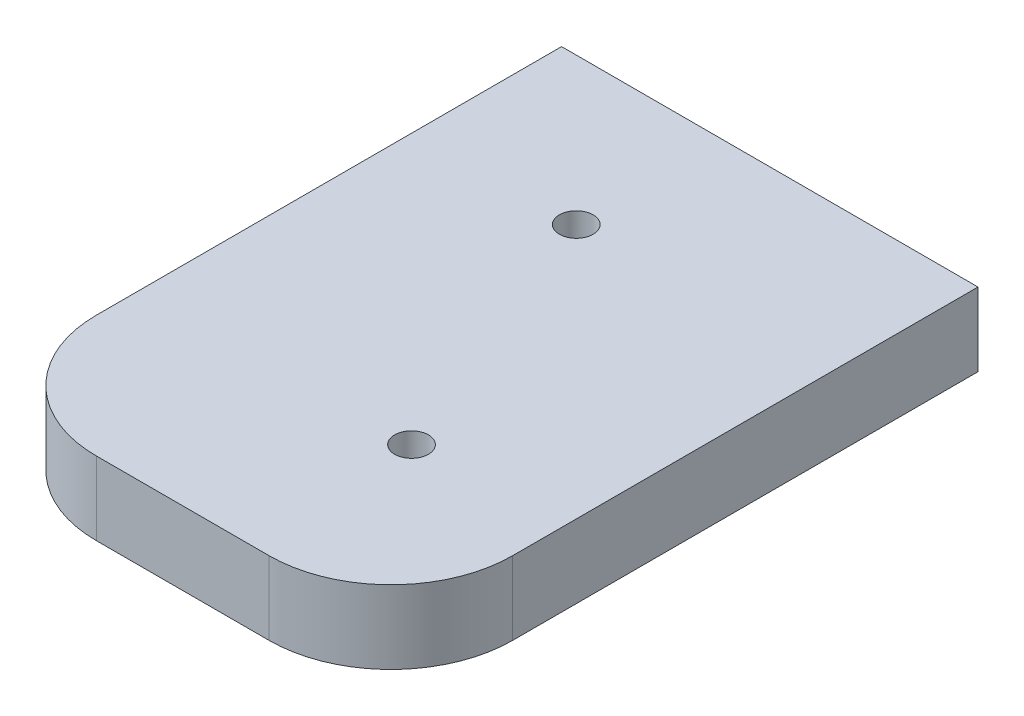
ISO-10303-21;
HEADER;
FILE_DESCRIPTION(('STEP AP214'),'2;1');
FILE_NAME('part.step','',(''),(''),'','','');
FILE_SCHEMA(('AUTOMOTIVE_DESIGN { 1 0 10303 214 1 1 1 1 }'));
ENDSEC;
DATA;
#1=APPLICATION_CONTEXT('core data for automotive mechanical design processes');
#2=APPLICATION_PROTOCOL_DEFINITION('international standard','automotive_design',2000,#1);
#3=PRODUCT_CONTEXT('',#1,'mechanical');
#4=PRODUCT('Part','Part','',(#3));
#5=PRODUCT_RELATED_PRODUCT_CATEGORY('part','',(#4));
#6=PRODUCT_DEFINITION_FORMATION('','',#4);
#7=PRODUCT_DEFINITION_CONTEXT('part definition',#1,'design');
#8=PRODUCT_DEFINITION('design','',#6,#7);
#9=PRODUCT_DEFINITION_SHAPE('','',#8);
#10=(LENGTH_UNIT() NAMED_UNIT(*) SI_UNIT(.MILLI.,.METRE.));
#11=(NAMED_UNIT(*) PLANE_ANGLE_UNIT() SI_UNIT($,.RADIAN.));
#12=(NAMED_UNIT(*) SI_UNIT($,.STERADIAN.) SOLID_ANGLE_UNIT());
#13=UNCERTAINTY_MEASURE_WITH_UNIT(LENGTH_MEASURE(1.E-05),#10,'distance_accuracy_value','');
#14=(GEOMETRIC_REPRESENTATION_CONTEXT(3) GLOBAL_UNCERTAINTY_ASSIGNED_CONTEXT((#13)) GLOBAL_UNIT_ASSIGNED_CONTEXT((#10,
#11,#12)) REPRESENTATION_CONTEXT('',''));
#15=CARTESIAN_POINT('',(0.,0.,0.));
#16=DIRECTION('',(0.,0.,1.));
#17=DIRECTION('',(1.,0.,0.));
#18=AXIS2_PLACEMENT_3D('',#15,#16,#17);
#19=CARTESIAN_POINT('',(0.,16.,0.));
#20=DIRECTION('',(0.,-1.,0.));
#21=DIRECTION('',(0.,0.,-1.));
#22=AXIS2_PLACEMENT_3D('',#19,#20,#21);
#23=PLANE('',#22);
#24=DIRECTION('',(-1.,0.,0.));
#25=VECTOR('',#24,1.);
#26=CARTESIAN_POINT('',(14.185,16.,-20.));
#27=LINE('',#26,#25);
#28=CARTESIAN_POINT('',(14.185,16.,-20.));
#29=VERTEX_POINT('',#28);
#30=CARTESIAN_POINT('',(-14.185,16.,-20.));
#31=VERTEX_POINT('',#30);
#32=EDGE_CURVE('E54',#29,#31,#27,.T.);
#33=ORIENTED_EDGE('',*,*,#32,.F.);
#34=DIRECTION('',(0.,0.,-1.));
#35=VECTOR('',#34,1.);
#36=CARTESIAN_POINT('',(14.185,16.,20.));
#37=LINE('',#36,#35);
#38=CARTESIAN_POINT('',(14.185,16.,11.7));
#39=VERTEX_POINT('',#38);
#40=EDGE_CURVE('E102',#39,#29,#37,.T.);
#41=ORIENTED_EDGE('',*,*,#40,.F.);
#42=CARTESIAN_POINT('',(5.885,16.,11.7));
#43=DIRECTION('',(0.,1.,0.));
#44=DIRECTION('',(0.,0.,1.));
#45=AXIS2_PLACEMENT_3D('',#42,#43,#44);
#46=CIRCLE('',#45,8.3);
#47=CARTESIAN_POINT('',(5.885,16.,20.));
#48=VERTEX_POINT('',#47);
#49=EDGE_CURVE('E80',#39,#48,#46,.F.);
#50=ORIENTED_EDGE('',*,*,#49,.T.);
#51=DIRECTION('',(1.,0.,0.));
#52=VECTOR('',#51,1.);
#53=CARTESIAN_POINT('',(-14.185,16.,20.));
#54=LINE('',#53,#52);
#55=CARTESIAN_POINT('',(-5.885,16.,20.));
#56=VERTEX_POINT('',#55);
#57=EDGE_CURVE('E129',#56,#48,#54,.T.);
#58=ORIENTED_EDGE('',*,*,#57,.F.);
#59=CARTESIAN_POINT('',(-5.885,16.,11.7));
#60=DIRECTION('',(0.,1.,0.));
#61=DIRECTION('',(0.,0.,1.));
#62=AXIS2_PLACEMENT_3D('',#59,#60,#61);
#63=CIRCLE('',#62,8.3);
#64=CARTESIAN_POINT('',(-14.185,16.,11.7));
#65=VERTEX_POINT('',#64);
#66=EDGE_CURVE('E72',#56,#65,#63,.F.);
#67=ORIENTED_EDGE('',*,*,#66,.T.);
#68=DIRECTION('',(0.,0.,1.));
#69=VECTOR('',#68,1.);
#70=CARTESIAN_POINT('',(-14.185,16.,-20.));
#71=LINE('',#70,#69);
#72=EDGE_CURVE('E104',#31,#65,#71,.T.);
#73=ORIENTED_EDGE('',*,*,#72,.F.);
#74=EDGE_LOOP('',(#33,#41,#50,#58,#67,#73));
#75=FACE_BOUND('',#74,.T.);
#76=CARTESIAN_POINT('',(-3.185,16.,-10.));
#77=DIRECTION('',(0.,-1.,0.));
#78=DIRECTION('',(0.,0.,-1.));
#79=AXIS2_PLACEMENT_3D('',#76,#77,#78);
#80=CIRCLE('',#79,1.15);
#81=CARTESIAN_POINT('',(-3.185,16.,-11.15));
#82=VERTEX_POINT('',#81);
#83=EDGE_CURVE('E46',#82,#82,#80,.T.);
#84=ORIENTED_EDGE('',*,*,#83,.F.);
#85=EDGE_LOOP('',(#84));
#86=FACE_BOUND('',#85,.T.);
#87=CARTESIAN_POINT('',(4.185,16.,8.59255496159686));
#88=DIRECTION('',(0.,1.,0.));
#89=DIRECTION('',(0.,0.,1.));
#90=AXIS2_PLACEMENT_3D('',#87,#88,#89);
#91=CIRCLE('',#90,1.15);
#92=CARTESIAN_POINT('',(4.185,16.,7.44255496159686));
#93=VERTEX_POINT('',#92);
#94=EDGE_CURVE('E113',#93,#93,#91,.T.);
#95=ORIENTED_EDGE('',*,*,#94,.T.);
#96=EDGE_LOOP('',(#95));
#97=FACE_BOUND('',#96,.T.);
#98=ADVANCED_FACE('F36',(#75,#86,#97),#23,.T.);
#99=CARTESIAN_POINT('',(-14.185,5.,-20.));
#100=DIRECTION('',(0.,0.,1.));
#101=DIRECTION('',(1.,0.,0.));
#102=AXIS2_PLACEMENT_3D('',#99,#100,#101);
#103=PLANE('',#102);
#104=DIRECTION('',(0.,-1.,0.));
#105=VECTOR('',#104,1.);
#106=CARTESIAN_POINT('',(14.185,5.,-20.));
#107=LINE('',#106,#105);
#108=CARTESIAN_POINT('',(14.185,21.,-20.));
#109=VERTEX_POINT('',#108);
#110=EDGE_CURVE('E40',#109,#29,#107,.T.);
#111=ORIENTED_EDGE('',*,*,#110,.T.);
#112=ORIENTED_EDGE('',*,*,#32,.T.);
#113=DIRECTION('',(0.,-1.,0.));
#114=VECTOR('',#113,1.);
#115=CARTESIAN_POINT('',(-14.185,21.,-20.));
#116=LINE('',#115,#114);
#117=CARTESIAN_POINT('',(-14.185,21.,-20.));
#118=VERTEX_POINT('',#117);
#119=EDGE_CURVE('E116',#118,#31,#116,.T.);
#120=ORIENTED_EDGE('',*,*,#119,.F.);
#121=DIRECTION('',(-1.,0.,0.));
#122=VECTOR('',#121,1.);
#123=CARTESIAN_POINT('',(14.185,21.,-20.));
#124=LINE('',#123,#122);
#125=EDGE_CURVE('E65',#109,#118,#124,.T.);
#126=ORIENTED_EDGE('',*,*,#125,.F.);
#127=EDGE_LOOP('',(#111,#112,#120,#126));
#128=FACE_BOUND('',#127,.T.);
#129=ADVANCED_FACE('F115',(#128),#103,.F.);
#130=CARTESIAN_POINT('',(-14.185,21.,-20.));
#131=DIRECTION('',(1.,0.,0.));
#132=DIRECTION('',(0.,0.,-1.));
#133=AXIS2_PLACEMENT_3D('',#130,#131,#132);
#134=PLANE('',#133);
#135=ORIENTED_EDGE('',*,*,#72,.T.);
#136=DIRECTION('',(0.,-1.,0.));
#137=VECTOR('',#136,1.);
#138=CARTESIAN_POINT('',(-14.185,21.,11.7));
#139=LINE('',#138,#137);
#140=CARTESIAN_POINT('',(-14.185,21.,11.7));
#141=VERTEX_POINT('',#140);
#142=EDGE_CURVE('E186',#65,#141,#139,.F.);
#143=ORIENTED_EDGE('',*,*,#142,.T.);
#144=DIRECTION('',(0.,0.,1.));
#145=VECTOR('',#144,1.);
#146=CARTESIAN_POINT('',(-14.185,21.,-20.));
#147=LINE('',#146,#145);
#148=EDGE_CURVE('E134',#118,#141,#147,.T.);
#149=ORIENTED_EDGE('',*,*,#148,.F.);
#150=ORIENTED_EDGE('',*,*,#119,.T.);
#151=EDGE_LOOP('',(#135,#143,#149,#150));
#152=FACE_BOUND('',#151,.T.);
#153=ADVANCED_FACE('F161',(#152),#134,.F.);
#154=CARTESIAN_POINT('',(14.185,5.,20.));
#155=DIRECTION('',(-1.,0.,0.));
#156=DIRECTION('',(0.,0.,1.));
#157=AXIS2_PLACEMENT_3D('',#154,#155,#156);
#158=PLANE('',#157);
#159=ORIENTED_EDGE('',*,*,#40,.T.);
#160=ORIENTED_EDGE('',*,*,#110,.F.);
#161=DIRECTION('',(0.,0.,-1.));
#162=VECTOR('',#161,1.);
#163=CARTESIAN_POINT('',(14.185,21.,20.));
#164=LINE('',#163,#162);
#165=CARTESIAN_POINT('',(14.185,21.,11.7));
#166=VERTEX_POINT('',#165);
#167=EDGE_CURVE('E131',#166,#109,#164,.T.);
#168=ORIENTED_EDGE('',*,*,#167,.F.);
#169=DIRECTION('',(0.,-1.,0.));
#170=VECTOR('',#169,1.);
#171=CARTESIAN_POINT('',(14.185,5.,11.7));
#172=LINE('',#171,#170);
#173=EDGE_CURVE('E112',#166,#39,#172,.T.);
#174=ORIENTED_EDGE('',*,*,#173,.T.);
#175=EDGE_LOOP('',(#159,#160,#168,#174));
#176=FACE_BOUND('',#175,.T.);
#177=ADVANCED_FACE('F109',(#176),#158,.F.);
#178=CARTESIAN_POINT('',(-14.185,21.,20.));
#179=DIRECTION('',(0.,0.,-1.));
#180=DIRECTION('',(-1.,0.,0.));
#181=AXIS2_PLACEMENT_3D('',#178,#179,#180);
#182=PLANE('',#181);
#183=DIRECTION('',(1.,0.,0.));
#184=VECTOR('',#183,1.);
#185=CARTESIAN_POINT('',(-14.185,21.,20.));
#186=LINE('',#185,#184);
#187=CARTESIAN_POINT('',(-5.885,21.,20.));
#188=VERTEX_POINT('',#187);
#189=CARTESIAN_POINT('',(5.885,21.,20.));
#190=VERTEX_POINT('',#189);
#191=EDGE_CURVE('E118',#188,#190,#186,.T.);
#192=ORIENTED_EDGE('',*,*,#191,.F.);
#193=DIRECTION('',(0.,-1.,0.));
#194=VECTOR('',#193,1.);
#195=CARTESIAN_POINT('',(-5.885,21.,20.));
#196=LINE('',#195,#194);
#197=EDGE_CURVE('E120',#188,#56,#196,.T.);
#198=ORIENTED_EDGE('',*,*,#197,.T.);
#199=ORIENTED_EDGE('',*,*,#57,.T.);
#200=DIRECTION('',(0.,-1.,0.));
#201=VECTOR('',#200,1.);
#202=CARTESIAN_POINT('',(5.885,21.,20.));
#203=LINE('',#202,#201);
#204=EDGE_CURVE('E117',#48,#190,#203,.F.);
#205=ORIENTED_EDGE('',*,*,#204,.T.);
#206=EDGE_LOOP('',(#192,#198,#199,#205));
#207=FACE_BOUND('',#206,.T.);
#208=ADVANCED_FACE('F169',(#207),#182,.F.);
#209=CARTESIAN_POINT('',(0.,21.,0.));
#210=DIRECTION('',(0.,1.,0.));
#211=DIRECTION('',(0.,0.,1.));
#212=AXIS2_PLACEMENT_3D('',#209,#210,#211);
#213=PLANE('',#212);
#214=CARTESIAN_POINT('',(-3.185,21.,-10.));
#215=DIRECTION('',(0.,1.,0.));
#216=DIRECTION('',(0.,0.,1.));
#217=AXIS2_PLACEMENT_3D('',#214,#215,#216);
#218=CIRCLE('',#217,1.15);
#219=CARTESIAN_POINT('',(-3.185,21.,-8.85));
#220=VERTEX_POINT('',#219);
#221=EDGE_CURVE('E11',#220,#220,#218,.F.);
#222=ORIENTED_EDGE('',*,*,#221,.T.);
#223=EDGE_LOOP('',(#222));
#224=FACE_BOUND('',#223,.T.);
#225=CARTESIAN_POINT('',(4.185,21.,8.59255496159686));
#226=DIRECTION('',(0.,-1.,0.));
#227=DIRECTION('',(0.,0.,-1.));
#228=AXIS2_PLACEMENT_3D('',#225,#226,#227);
#229=CIRCLE('',#228,1.15);
#230=CARTESIAN_POINT('',(4.185,21.,7.44255496159686));
#231=VERTEX_POINT('',#230);
#232=EDGE_CURVE('E140',#231,#231,#229,.T.);
#233=ORIENTED_EDGE('',*,*,#232,.T.);
#234=EDGE_LOOP('',(#233));
#235=FACE_BOUND('',#234,.T.);
#236=ORIENTED_EDGE('',*,*,#148,.T.);
#237=CARTESIAN_POINT('',(-5.885,21.,11.7));
#238=DIRECTION('',(0.,1.,0.));
#239=DIRECTION('',(0.,0.,1.));
#240=AXIS2_PLACEMENT_3D('',#237,#238,#239);
#241=CIRCLE('',#240,8.3);
#242=EDGE_CURVE('E187',#141,#188,#241,.T.);
#243=ORIENTED_EDGE('',*,*,#242,.T.);
#244=ORIENTED_EDGE('',*,*,#191,.T.);
#245=CARTESIAN_POINT('',(5.885,21.,11.7));
#246=DIRECTION('',(0.,1.,0.));
#247=DIRECTION('',(0.,0.,1.));
#248=AXIS2_PLACEMENT_3D('',#245,#246,#247);
#249=CIRCLE('',#248,8.3);
#250=EDGE_CURVE('E185',#190,#166,#249,.T.);
#251=ORIENTED_EDGE('',*,*,#250,.T.);
#252=ORIENTED_EDGE('',*,*,#167,.T.);
#253=ORIENTED_EDGE('',*,*,#125,.T.);
#254=EDGE_LOOP('',(#236,#243,#244,#251,#252,#253));
#255=FACE_BOUND('',#254,.T.);
#256=ADVANCED_FACE('F171',(#224,#235,#255),#213,.T.);
#257=CARTESIAN_POINT('',(5.885,5.,11.7));
#258=DIRECTION('',(0.,-1.,0.));
#259=DIRECTION('',(0.,0.,-1.));
#260=AXIS2_PLACEMENT_3D('',#257,#258,#259);
#261=CYLINDRICAL_SURFACE('',#260,8.3);
#262=ORIENTED_EDGE('',*,*,#250,.F.);
#263=ORIENTED_EDGE('',*,*,#204,.F.);
#264=ORIENTED_EDGE('',*,*,#49,.F.);
#265=ORIENTED_EDGE('',*,*,#173,.F.);
#266=EDGE_LOOP('',(#262,#263,#264,#265));
#267=FACE_BOUND('',#266,.T.);
#268=ADVANCED_FACE('F174',(#267),#261,.T.);
#269=CARTESIAN_POINT('',(-5.885,21.,11.7));
#270=DIRECTION('',(0.,-1.,0.));
#271=DIRECTION('',(0.,0.,-1.));
#272=AXIS2_PLACEMENT_3D('',#269,#270,#271);
#273=CYLINDRICAL_SURFACE('',#272,8.3);
#274=ORIENTED_EDGE('',*,*,#242,.F.);
#275=ORIENTED_EDGE('',*,*,#142,.F.);
#276=ORIENTED_EDGE('',*,*,#66,.F.);
#277=ORIENTED_EDGE('',*,*,#197,.F.);
#278=EDGE_LOOP('',(#274,#275,#276,#277));
#279=FACE_BOUND('',#278,.T.);
#280=ADVANCED_FACE('F156',(#279),#273,.T.);
#281=CARTESIAN_POINT('',(-3.185,21.001,-10.));
#282=DIRECTION('',(0.,-1.,0.));
#283=DIRECTION('',(0.,0.,-1.));
#284=AXIS2_PLACEMENT_3D('',#281,#282,#283);
#285=CYLINDRICAL_SURFACE('',#284,1.15);
#286=ORIENTED_EDGE('',*,*,#221,.F.);
#287=EDGE_LOOP('',(#286));
#288=FACE_BOUND('',#287,.T.);
#289=ORIENTED_EDGE('',*,*,#83,.T.);
#290=EDGE_LOOP('',(#289));
#291=FACE_BOUND('',#290,.T.);
#292=ADVANCED_FACE('F145',(#288,#291),#285,.F.);
#293=CARTESIAN_POINT('',(4.185,21.,8.59255496159686));
#294=DIRECTION('',(0.,-1.,0.));
#295=DIRECTION('',(0.,0.,-1.));
#296=AXIS2_PLACEMENT_3D('',#293,#294,#295);
#297=CYLINDRICAL_SURFACE('',#296,1.15);
#298=CARTESIAN_POINT('',(4.185,21.,7.44255496159686));
#299=CARTESIAN_POINT('',(4.185,20.9479166666667,7.44255496159686));
#300=CARTESIAN_POINT('',(4.185,20.8958333333333,7.44255496159686));
#301=CARTESIAN_POINT('',(4.185,20.7916666666667,7.44255496159686));
#302=CARTESIAN_POINT('',(4.185,20.7395833333333,7.44255496159686));
#303=CARTESIAN_POINT('',(4.185,20.6354166666667,7.44255496159686));
#304=CARTESIAN_POINT('',(4.185,20.5833333333333,7.44255496159686));
#305=CARTESIAN_POINT('',(4.185,20.4791666666667,7.44255496159686));
#306=CARTESIAN_POINT('',(4.185,20.4270833333333,7.44255496159686));
#307=CARTESIAN_POINT('',(4.185,20.3229166666667,7.44255496159686));
#308=CARTESIAN_POINT('',(4.185,20.2708333333333,7.44255496159686));
#309=CARTESIAN_POINT('',(4.185,20.1666666666667,7.44255496159686));
#310=CARTESIAN_POINT('',(4.185,20.1145833333333,7.44255496159686));
#311=CARTESIAN_POINT('',(4.185,20.0104166666667,7.44255496159686));
#312=CARTESIAN_POINT('',(4.185,19.9583333333333,7.44255496159686));
#313=CARTESIAN_POINT('',(4.185,19.8541666666667,7.44255496159686));
#314=CARTESIAN_POINT('',(4.185,19.8020833333333,7.44255496159686));
#315=CARTESIAN_POINT('',(4.185,19.6979166666667,7.44255496159686));
#316=CARTESIAN_POINT('',(4.185,19.6458333333333,7.44255496159686));
#317=CARTESIAN_POINT('',(4.185,19.5416666666667,7.44255496159686));
#318=CARTESIAN_POINT('',(4.185,19.4895833333333,7.44255496159686));
#319=CARTESIAN_POINT('',(4.185,19.3854166666667,7.44255496159686));
#320=CARTESIAN_POINT('',(4.185,19.3333333333333,7.44255496159686));
#321=CARTESIAN_POINT('',(4.185,19.2291666666667,7.44255496159686));
#322=CARTESIAN_POINT('',(4.185,19.1770833333333,7.44255496159686));
#323=CARTESIAN_POINT('',(4.185,19.0729166666667,7.44255496159686));
#324=CARTESIAN_POINT('',(4.185,19.0208333333333,7.44255496159686));
#325=CARTESIAN_POINT('',(4.185,18.9166666666667,7.44255496159686));
#326=CARTESIAN_POINT('',(4.185,18.8645833333333,7.44255496159686));
#327=CARTESIAN_POINT('',(4.185,18.7604166666667,7.44255496159686));
#328=CARTESIAN_POINT('',(4.185,18.7083333333333,7.44255496159686));
#329=CARTESIAN_POINT('',(4.185,18.6041666666667,7.44255496159686));
#330=CARTESIAN_POINT('',(4.185,18.5520833333333,7.44255496159686));
#331=CARTESIAN_POINT('',(4.185,18.4479166666667,7.44255496159686));
#332=CARTESIAN_POINT('',(4.185,18.3958333333333,7.44255496159686));
#333=CARTESIAN_POINT('',(4.185,18.2916666666667,7.44255496159686));
#334=CARTESIAN_POINT('',(4.185,18.2395833333333,7.44255496159686));
#335=CARTESIAN_POINT('',(4.185,18.1354166666667,7.44255496159686));
#336=CARTESIAN_POINT('',(4.185,18.0833333333333,7.44255496159686));
#337=CARTESIAN_POINT('',(4.185,17.9791666666667,7.44255496159686));
#338=CARTESIAN_POINT('',(4.185,17.9270833333333,7.44255496159686));
#339=CARTESIAN_POINT('',(4.185,17.8229166666667,7.44255496159686));
#340=CARTESIAN_POINT('',(4.185,17.7708333333333,7.44255496159686));
#341=CARTESIAN_POINT('',(4.185,17.6666666666667,7.44255496159686));
#342=CARTESIAN_POINT('',(4.185,17.6145833333333,7.44255496159686));
#343=CARTESIAN_POINT('',(4.185,17.5104166666667,7.44255496159686));
#344=CARTESIAN_POINT('',(4.185,17.4583333333333,7.44255496159686));
#345=CARTESIAN_POINT('',(4.185,17.3541666666667,7.44255496159686));
#346=CARTESIAN_POINT('',(4.185,17.3020833333333,7.44255496159686));
#347=CARTESIAN_POINT('',(4.185,17.1979166666667,7.44255496159686));
#348=CARTESIAN_POINT('',(4.185,17.1458333333333,7.44255496159686));
#349=CARTESIAN_POINT('',(4.185,17.0416666666667,7.44255496159686));
#350=CARTESIAN_POINT('',(4.185,16.9895833333333,7.44255496159686));
#351=CARTESIAN_POINT('',(4.185,16.8854166666667,7.44255496159686));
#352=CARTESIAN_POINT('',(4.185,16.8333333333333,7.44255496159686));
#353=CARTESIAN_POINT('',(4.185,16.7291666666667,7.44255496159686));
#354=CARTESIAN_POINT('',(4.185,16.6770833333333,7.44255496159686));
#355=CARTESIAN_POINT('',(4.185,16.5729166666667,7.44255496159686));
#356=CARTESIAN_POINT('',(4.185,16.5208333333333,7.44255496159686));
#357=CARTESIAN_POINT('',(4.185,16.4166666666667,7.44255496159686));
#358=CARTESIAN_POINT('',(4.185,16.3645833333333,7.44255496159686));
#359=CARTESIAN_POINT('',(4.185,16.2604166666667,7.44255496159686));
#360=CARTESIAN_POINT('',(4.185,16.2083333333333,7.44255496159686));
#361=CARTESIAN_POINT('',(4.185,16.1041666666667,7.44255496159686));
#362=CARTESIAN_POINT('',(4.185,16.0520833333333,7.44255496159686));
#363=CARTESIAN_POINT('',(4.185,16.,7.44255496159686));
#364=B_SPLINE_CURVE_WITH_KNOTS('',3,(#298,#299,#300,#301,#302,#303,#304,#305,#306,#307,#308,
#309,#310,#311,#312,#313,#314,#315,#316,#317,#318,#319,#320,#321,#322,#323,#324,#325,#326,#327,
#328,#329,#330,#331,#332,#333,#334,#335,#336,#337,#338,#339,#340,#341,#342,#343,#344,#345,#346,
#347,#348,#349,#350,#351,#352,#353,#354,#355,#356,#357,#358,#359,#360,#361,#362,#363),
.UNSPECIFIED.,.F.,.F.,(4,2,2,2,2,2,2,2,2,2,2,2,2,2,2,2,2,2,2,2,2,2,2,2,2,2,2,2,2,2,2,2,4),(0.,
0.15625,0.3125,0.46875,0.625000000000001,0.781250000000001,0.937500000000001,1.09375,1.25,
1.40625,1.5625,1.71875,1.875,2.03125,2.1875,2.34375,2.5,2.65625,2.8125,2.96875,3.125,3.28125,
3.4375,3.59375,3.75,3.90625,4.0625,4.21875,4.375,4.53125,4.6875,4.84375,5.),.UNSPECIFIED.);
#365=EDGE_CURVE('BSEAM38',#231,#93,#364,.T.);
#366=ORIENTED_EDGE('',*,*,#232,.F.);
#367=ORIENTED_EDGE('',*,*,#94,.F.);
#368=ORIENTED_EDGE('',*,*,#365,.T.);
#369=ORIENTED_EDGE('',*,*,#365,.F.);
#370=EDGE_LOOP('',(#366,#368,#367,#369));
#371=FACE_BOUND('',#370,.T.);
#372=ADVANCED_FACE('F38',(#371),#297,.F.);
#373=CLOSED_SHELL('',(#98,#129,#153,#177,#208,#256,#268,#280,#292,#372));
#374=MANIFOLD_SOLID_BREP('B2',#373);
#375=ADVANCED_BREP_SHAPE_REPRESENTATION('',(#18,#374),#14);
#376=SHAPE_DEFINITION_REPRESENTATION(#9,#375);
ENDSEC;
END-ISO-10303-21;
